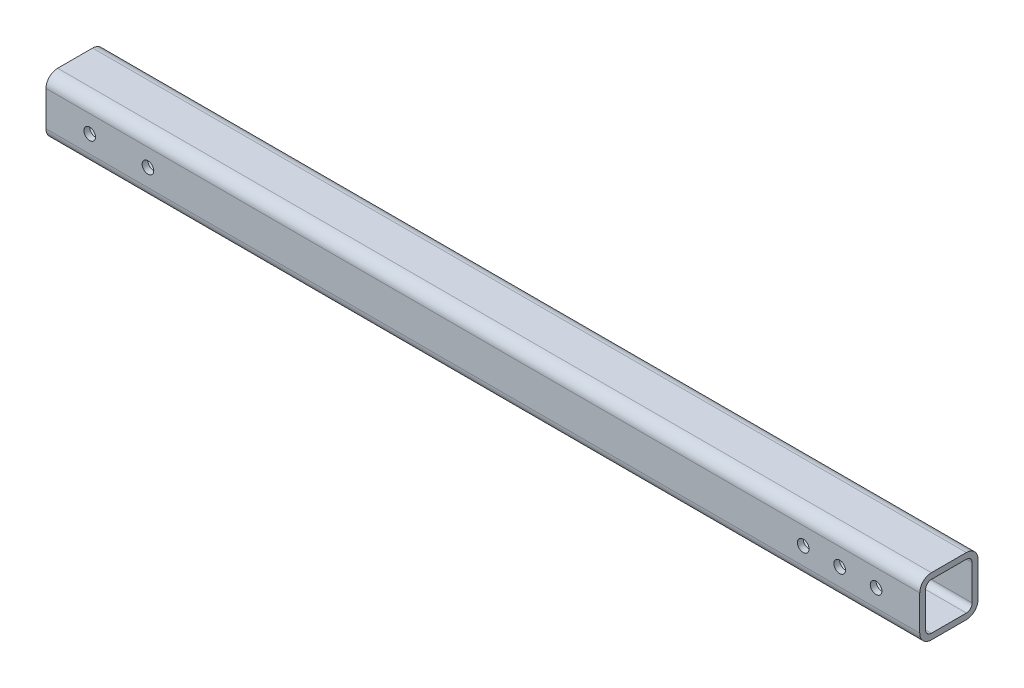
ISO-10303-21;
HEADER;
FILE_DESCRIPTION(('STEP AP214'),'2;1');
FILE_NAME('part.step','',(''),(''),'','','');
FILE_SCHEMA(('AUTOMOTIVE_DESIGN { 1 0 10303 214 1 1 1 1 }'));
ENDSEC;
DATA;
#1=APPLICATION_CONTEXT('core data for automotive mechanical design processes');
#2=APPLICATION_PROTOCOL_DEFINITION('international standard','automotive_design',2000,#1);
#3=PRODUCT_CONTEXT('',#1,'mechanical');
#4=PRODUCT('Part','Part','',(#3));
#5=PRODUCT_RELATED_PRODUCT_CATEGORY('part','',(#4));
#6=PRODUCT_DEFINITION_FORMATION('','',#4);
#7=PRODUCT_DEFINITION_CONTEXT('part definition',#1,'design');
#8=PRODUCT_DEFINITION('design','',#6,#7);
#9=PRODUCT_DEFINITION_SHAPE('','',#8);
#10=(LENGTH_UNIT() NAMED_UNIT(*) SI_UNIT(.MILLI.,.METRE.));
#11=(NAMED_UNIT(*) PLANE_ANGLE_UNIT() SI_UNIT($,.RADIAN.));
#12=(NAMED_UNIT(*) SI_UNIT($,.STERADIAN.) SOLID_ANGLE_UNIT());
#13=UNCERTAINTY_MEASURE_WITH_UNIT(LENGTH_MEASURE(1.E-05),#10,'distance_accuracy_value','');
#14=(GEOMETRIC_REPRESENTATION_CONTEXT(3) GLOBAL_UNCERTAINTY_ASSIGNED_CONTEXT((#13)) GLOBAL_UNIT_ASSIGNED_CONTEXT((#10,
#11,#12)) REPRESENTATION_CONTEXT('',''));
#15=CARTESIAN_POINT('',(0.,0.,0.));
#16=DIRECTION('',(0.,0.,1.));
#17=DIRECTION('',(1.,0.,0.));
#18=AXIS2_PLACEMENT_3D('',#15,#16,#17);
#19=CARTESIAN_POINT('',(300.,12.,-12.));
#20=DIRECTION('',(-1.,0.,0.));
#21=DIRECTION('',(0.,0.,1.));
#22=AXIS2_PLACEMENT_3D('',#19,#20,#21);
#23=CYLINDRICAL_SURFACE('',#22,8.);
#24=CARTESIAN_POINT('',(-300.,12.,-12.));
#25=DIRECTION('',(1.,0.,0.));
#26=DIRECTION('',(0.,0.,-1.));
#27=AXIS2_PLACEMENT_3D('',#24,#25,#26);
#28=CIRCLE('',#27,8.);
#29=CARTESIAN_POINT('',(-300.,12.,-20.));
#30=VERTEX_POINT('',#29);
#31=CARTESIAN_POINT('',(-300.,20.,-12.));
#32=VERTEX_POINT('',#31);
#33=EDGE_CURVE('E254',#30,#32,#28,.T.);
#34=ORIENTED_EDGE('',*,*,#33,.T.);
#35=DIRECTION('',(-1.,0.,0.));
#36=VECTOR('',#35,1.);
#37=CARTESIAN_POINT('',(300.,20.,-12.));
#38=LINE('',#37,#36);
#39=CARTESIAN_POINT('',(300.,20.,-12.));
#40=VERTEX_POINT('',#39);
#41=EDGE_CURVE('E12',#40,#32,#38,.T.);
#42=ORIENTED_EDGE('',*,*,#41,.F.);
#43=CARTESIAN_POINT('',(300.,12.,-12.));
#44=DIRECTION('',(1.,0.,0.));
#45=DIRECTION('',(0.,0.,-1.));
#46=AXIS2_PLACEMENT_3D('',#43,#44,#45);
#47=CIRCLE('',#46,8.);
#48=CARTESIAN_POINT('',(300.,12.,-20.));
#49=VERTEX_POINT('',#48);
#50=EDGE_CURVE('E403',#49,#40,#47,.T.);
#51=ORIENTED_EDGE('',*,*,#50,.F.);
#52=DIRECTION('',(-1.,0.,0.));
#53=VECTOR('',#52,1.);
#54=CARTESIAN_POINT('',(300.,12.,-20.));
#55=LINE('',#54,#53);
#56=EDGE_CURVE('E277',#49,#30,#55,.T.);
#57=ORIENTED_EDGE('',*,*,#56,.T.);
#58=EDGE_LOOP('',(#34,#42,#51,#57));
#59=FACE_BOUND('',#58,.T.);
#60=ADVANCED_FACE('F67',(#59),#23,.T.);
#61=CARTESIAN_POINT('',(300.,20.,-12.));
#62=DIRECTION('',(0.,-1.,0.));
#63=DIRECTION('',(0.,0.,-1.));
#64=AXIS2_PLACEMENT_3D('',#61,#62,#63);
#65=PLANE('',#64);
#66=DIRECTION('',(0.,0.,1.));
#67=VECTOR('',#66,1.);
#68=CARTESIAN_POINT('',(-300.,20.,-12.));
#69=LINE('',#68,#67);
#70=CARTESIAN_POINT('',(-300.,20.,12.));
#71=VERTEX_POINT('',#70);
#72=EDGE_CURVE('E258',#32,#71,#69,.T.);
#73=ORIENTED_EDGE('',*,*,#72,.T.);
#74=DIRECTION('',(-1.,0.,0.));
#75=VECTOR('',#74,1.);
#76=CARTESIAN_POINT('',(300.,20.,12.));
#77=LINE('',#76,#75);
#78=CARTESIAN_POINT('',(300.,20.,12.));
#79=VERTEX_POINT('',#78);
#80=EDGE_CURVE('E78',#79,#71,#77,.T.);
#81=ORIENTED_EDGE('',*,*,#80,.F.);
#82=DIRECTION('',(0.,0.,1.));
#83=VECTOR('',#82,1.);
#84=CARTESIAN_POINT('',(300.,20.,-12.));
#85=LINE('',#84,#83);
#86=EDGE_CURVE('E406',#40,#79,#85,.T.);
#87=ORIENTED_EDGE('',*,*,#86,.F.);
#88=ORIENTED_EDGE('',*,*,#41,.T.);
#89=EDGE_LOOP('',(#73,#81,#87,#88));
#90=FACE_BOUND('',#89,.T.);
#91=ADVANCED_FACE('F443',(#90),#65,.F.);
#92=CARTESIAN_POINT('',(300.,12.,12.));
#93=DIRECTION('',(-1.,0.,0.));
#94=DIRECTION('',(0.,0.,1.));
#95=AXIS2_PLACEMENT_3D('',#92,#93,#94);
#96=CYLINDRICAL_SURFACE('',#95,8.);
#97=CARTESIAN_POINT('',(-300.,12.,12.));
#98=DIRECTION('',(1.,0.,0.));
#99=DIRECTION('',(0.,0.,-1.));
#100=AXIS2_PLACEMENT_3D('',#97,#98,#99);
#101=CIRCLE('',#100,8.);
#102=CARTESIAN_POINT('',(-300.,12.,20.));
#103=VERTEX_POINT('',#102);
#104=EDGE_CURVE('E261',#71,#103,#101,.T.);
#105=ORIENTED_EDGE('',*,*,#104,.T.);
#106=DIRECTION('',(-1.,0.,0.));
#107=VECTOR('',#106,1.);
#108=CARTESIAN_POINT('',(300.,12.,20.));
#109=LINE('',#108,#107);
#110=CARTESIAN_POINT('',(300.,12.,20.));
#111=VERTEX_POINT('',#110);
#112=EDGE_CURVE('E288',#111,#103,#109,.T.);
#113=ORIENTED_EDGE('',*,*,#112,.F.);
#114=CARTESIAN_POINT('',(300.,12.,12.));
#115=DIRECTION('',(1.,0.,0.));
#116=DIRECTION('',(0.,0.,-1.));
#117=AXIS2_PLACEMENT_3D('',#114,#115,#116);
#118=CIRCLE('',#117,8.);
#119=EDGE_CURVE('E409',#79,#111,#118,.T.);
#120=ORIENTED_EDGE('',*,*,#119,.F.);
#121=ORIENTED_EDGE('',*,*,#80,.T.);
#122=EDGE_LOOP('',(#105,#113,#120,#121));
#123=FACE_BOUND('',#122,.T.);
#124=ADVANCED_FACE('F449',(#123),#96,.T.);
#125=CARTESIAN_POINT('',(300.,-12.,20.));
#126=DIRECTION('',(0.,0.,-1.));
#127=DIRECTION('',(-1.,0.,0.));
#128=AXIS2_PLACEMENT_3D('',#125,#126,#127);
#129=PLANE('',#128);
#130=CARTESIAN_POINT('',(-270.,0.,20.));
#131=DIRECTION('',(0.,0.,-1.));
#132=DIRECTION('',(-1.,0.,0.));
#133=AXIS2_PLACEMENT_3D('',#130,#131,#132);
#134=CIRCLE('',#133,3.99999999999999);
#135=CARTESIAN_POINT('',(-274.,0.,20.));
#136=VERTEX_POINT('',#135);
#137=EDGE_CURVE('E226',#136,#136,#134,.T.);
#138=ORIENTED_EDGE('',*,*,#137,.T.);
#139=EDGE_LOOP('',(#138));
#140=FACE_BOUND('',#139,.T.);
#141=CARTESIAN_POINT('',(-230.,0.,20.));
#142=DIRECTION('',(0.,0.,-1.));
#143=DIRECTION('',(-1.,0.,0.));
#144=AXIS2_PLACEMENT_3D('',#141,#142,#143);
#145=CIRCLE('',#144,3.99999999999999);
#146=CARTESIAN_POINT('',(-234.,0.,20.));
#147=VERTEX_POINT('',#146);
#148=EDGE_CURVE('E358',#147,#147,#145,.T.);
#149=ORIENTED_EDGE('',*,*,#148,.T.);
#150=EDGE_LOOP('',(#149));
#151=FACE_BOUND('',#150,.T.);
#152=CARTESIAN_POINT('',(220.,0.,20.));
#153=DIRECTION('',(0.,0.,-1.));
#154=DIRECTION('',(-1.,0.,0.));
#155=AXIS2_PLACEMENT_3D('',#152,#153,#154);
#156=CIRCLE('',#155,3.99999999999999);
#157=CARTESIAN_POINT('',(216.,0.,20.));
#158=VERTEX_POINT('',#157);
#159=EDGE_CURVE('E337',#158,#158,#156,.T.);
#160=ORIENTED_EDGE('',*,*,#159,.T.);
#161=EDGE_LOOP('',(#160));
#162=FACE_BOUND('',#161,.T.);
#163=CARTESIAN_POINT('',(245.,0.,20.));
#164=DIRECTION('',(0.,0.,-1.));
#165=DIRECTION('',(-1.,0.,0.));
#166=AXIS2_PLACEMENT_3D('',#163,#164,#165);
#167=CIRCLE('',#166,3.99999999999999);
#168=CARTESIAN_POINT('',(241.,0.,20.));
#169=VERTEX_POINT('',#168);
#170=EDGE_CURVE('E332',#169,#169,#167,.T.);
#171=ORIENTED_EDGE('',*,*,#170,.T.);
#172=EDGE_LOOP('',(#171));
#173=FACE_BOUND('',#172,.T.);
#174=CARTESIAN_POINT('',(270.,0.,20.));
#175=DIRECTION('',(0.,0.,-1.));
#176=DIRECTION('',(-1.,0.,0.));
#177=AXIS2_PLACEMENT_3D('',#174,#175,#176);
#178=CIRCLE('',#177,3.99999999999999);
#179=CARTESIAN_POINT('',(266.,0.,20.));
#180=VERTEX_POINT('',#179);
#181=EDGE_CURVE('E327',#180,#180,#178,.T.);
#182=ORIENTED_EDGE('',*,*,#181,.T.);
#183=EDGE_LOOP('',(#182));
#184=FACE_BOUND('',#183,.T.);
#185=DIRECTION('',(0.,-1.,0.));
#186=VECTOR('',#185,1.);
#187=CARTESIAN_POINT('',(-300.,-12.,20.));
#188=LINE('',#187,#186);
#189=CARTESIAN_POINT('',(-300.,-12.,20.));
#190=VERTEX_POINT('',#189);
#191=EDGE_CURVE('E264',#103,#190,#188,.T.);
#192=ORIENTED_EDGE('',*,*,#191,.T.);
#193=DIRECTION('',(-1.,0.,0.));
#194=VECTOR('',#193,1.);
#195=CARTESIAN_POINT('',(300.,-12.,20.));
#196=LINE('',#195,#194);
#197=CARTESIAN_POINT('',(300.,-12.,20.));
#198=VERTEX_POINT('',#197);
#199=EDGE_CURVE('E284',#198,#190,#196,.T.);
#200=ORIENTED_EDGE('',*,*,#199,.F.);
#201=DIRECTION('',(0.,-1.,0.));
#202=VECTOR('',#201,1.);
#203=CARTESIAN_POINT('',(300.,-12.,20.));
#204=LINE('',#203,#202);
#205=EDGE_CURVE('E412',#111,#198,#204,.T.);
#206=ORIENTED_EDGE('',*,*,#205,.F.);
#207=ORIENTED_EDGE('',*,*,#112,.T.);
#208=EDGE_LOOP('',(#192,#200,#206,#207));
#209=FACE_BOUND('',#208,.T.);
#210=ADVANCED_FACE('F520',(#140,#151,#162,#173,#184,#209),#129,.F.);
#211=CARTESIAN_POINT('',(300.,-12.,12.));
#212=DIRECTION('',(-1.,0.,0.));
#213=DIRECTION('',(0.,0.,1.));
#214=AXIS2_PLACEMENT_3D('',#211,#212,#213);
#215=CYLINDRICAL_SURFACE('',#214,8.);
#216=CARTESIAN_POINT('',(-300.,-12.,12.));
#217=DIRECTION('',(1.,0.,0.));
#218=DIRECTION('',(0.,0.,-1.));
#219=AXIS2_PLACEMENT_3D('',#216,#217,#218);
#220=CIRCLE('',#219,8.);
#221=CARTESIAN_POINT('',(-300.,-20.,12.));
#222=VERTEX_POINT('',#221);
#223=EDGE_CURVE('E267',#190,#222,#220,.T.);
#224=ORIENTED_EDGE('',*,*,#223,.T.);
#225=DIRECTION('',(-1.,0.,0.));
#226=VECTOR('',#225,1.);
#227=CARTESIAN_POINT('',(300.,-20.,12.));
#228=LINE('',#227,#226);
#229=CARTESIAN_POINT('',(300.,-20.,12.));
#230=VERTEX_POINT('',#229);
#231=EDGE_CURVE('E210',#230,#222,#228,.T.);
#232=ORIENTED_EDGE('',*,*,#231,.F.);
#233=CARTESIAN_POINT('',(300.,-12.,12.));
#234=DIRECTION('',(1.,0.,0.));
#235=DIRECTION('',(0.,0.,-1.));
#236=AXIS2_PLACEMENT_3D('',#233,#234,#235);
#237=CIRCLE('',#236,8.);
#238=EDGE_CURVE('E199',#198,#230,#237,.T.);
#239=ORIENTED_EDGE('',*,*,#238,.F.);
#240=ORIENTED_EDGE('',*,*,#199,.T.);
#241=EDGE_LOOP('',(#224,#232,#239,#240));
#242=FACE_BOUND('',#241,.T.);
#243=ADVANCED_FACE('F517',(#242),#215,.T.);
#244=CARTESIAN_POINT('',(300.,-20.,12.));
#245=DIRECTION('',(0.,1.,0.));
#246=DIRECTION('',(0.,0.,1.));
#247=AXIS2_PLACEMENT_3D('',#244,#245,#246);
#248=PLANE('',#247);
#249=DIRECTION('',(0.,0.,-1.));
#250=VECTOR('',#249,1.);
#251=CARTESIAN_POINT('',(-300.,-20.,12.));
#252=LINE('',#251,#250);
#253=CARTESIAN_POINT('',(-300.,-20.,-12.));
#254=VERTEX_POINT('',#253);
#255=EDGE_CURVE('E208',#222,#254,#252,.T.);
#256=ORIENTED_EDGE('',*,*,#255,.T.);
#257=DIRECTION('',(-1.,0.,0.));
#258=VECTOR('',#257,1.);
#259=CARTESIAN_POINT('',(300.,-20.,-12.));
#260=LINE('',#259,#258);
#261=CARTESIAN_POINT('',(300.,-20.,-12.));
#262=VERTEX_POINT('',#261);
#263=EDGE_CURVE('E205',#262,#254,#260,.T.);
#264=ORIENTED_EDGE('',*,*,#263,.F.);
#265=DIRECTION('',(0.,0.,-1.));
#266=VECTOR('',#265,1.);
#267=CARTESIAN_POINT('',(300.,-20.,12.));
#268=LINE('',#267,#266);
#269=EDGE_CURVE('E193',#230,#262,#268,.T.);
#270=ORIENTED_EDGE('',*,*,#269,.F.);
#271=ORIENTED_EDGE('',*,*,#231,.T.);
#272=EDGE_LOOP('',(#256,#264,#270,#271));
#273=FACE_BOUND('',#272,.T.);
#274=ADVANCED_FACE('F206',(#273),#248,.F.);
#275=CARTESIAN_POINT('',(300.,-12.,-12.));
#276=DIRECTION('',(-1.,0.,0.));
#277=DIRECTION('',(0.,0.,1.));
#278=AXIS2_PLACEMENT_3D('',#275,#276,#277);
#279=CYLINDRICAL_SURFACE('',#278,8.);
#280=CARTESIAN_POINT('',(-300.,-12.,-12.));
#281=DIRECTION('',(1.,0.,0.));
#282=DIRECTION('',(0.,0.,-1.));
#283=AXIS2_PLACEMENT_3D('',#280,#281,#282);
#284=CIRCLE('',#283,8.);
#285=CARTESIAN_POINT('',(-300.,-12.,-20.));
#286=VERTEX_POINT('',#285);
#287=EDGE_CURVE('E140',#254,#286,#284,.T.);
#288=ORIENTED_EDGE('',*,*,#287,.T.);
#289=DIRECTION('',(-1.,0.,0.));
#290=VECTOR('',#289,1.);
#291=CARTESIAN_POINT('',(300.,-12.,-20.));
#292=LINE('',#291,#290);
#293=CARTESIAN_POINT('',(300.,-12.,-20.));
#294=VERTEX_POINT('',#293);
#295=EDGE_CURVE('E211',#294,#286,#292,.T.);
#296=ORIENTED_EDGE('',*,*,#295,.F.);
#297=CARTESIAN_POINT('',(300.,-12.,-12.));
#298=DIRECTION('',(1.,0.,0.));
#299=DIRECTION('',(0.,0.,-1.));
#300=AXIS2_PLACEMENT_3D('',#297,#298,#299);
#301=CIRCLE('',#300,8.);
#302=EDGE_CURVE('E197',#262,#294,#301,.T.);
#303=ORIENTED_EDGE('',*,*,#302,.F.);
#304=ORIENTED_EDGE('',*,*,#263,.T.);
#305=EDGE_LOOP('',(#288,#296,#303,#304));
#306=FACE_BOUND('',#305,.T.);
#307=ADVANCED_FACE('F213',(#306),#279,.T.);
#308=CARTESIAN_POINT('',(300.,12.,12.));
#309=DIRECTION('',(-1.,0.,0.));
#310=DIRECTION('',(0.,0.,1.));
#311=AXIS2_PLACEMENT_3D('',#308,#309,#310);
#312=CYLINDRICAL_SURFACE('',#311,4.00000000000001);
#313=CARTESIAN_POINT('',(-300.,12.,12.));
#314=DIRECTION('',(1.,0.,0.));
#315=DIRECTION('',(0.,0.,-1.));
#316=AXIS2_PLACEMENT_3D('',#313,#314,#315);
#317=CIRCLE('',#316,4.00000000000001);
#318=CARTESIAN_POINT('',(-300.,16.,12.));
#319=VERTEX_POINT('',#318);
#320=CARTESIAN_POINT('',(-300.,12.,16.));
#321=VERTEX_POINT('',#320);
#322=EDGE_CURVE('E221',#319,#321,#317,.T.);
#323=ORIENTED_EDGE('',*,*,#322,.F.);
#324=DIRECTION('',(-1.,0.,0.));
#325=VECTOR('',#324,1.);
#326=CARTESIAN_POINT('',(300.,16.,12.));
#327=LINE('',#326,#325);
#328=CARTESIAN_POINT('',(300.,16.,12.));
#329=VERTEX_POINT('',#328);
#330=EDGE_CURVE('E154',#329,#319,#327,.T.);
#331=ORIENTED_EDGE('',*,*,#330,.F.);
#332=CARTESIAN_POINT('',(300.,12.,12.));
#333=DIRECTION('',(1.,0.,0.));
#334=DIRECTION('',(0.,0.,-1.));
#335=AXIS2_PLACEMENT_3D('',#332,#333,#334);
#336=CIRCLE('',#335,4.00000000000001);
#337=CARTESIAN_POINT('',(300.,12.,16.));
#338=VERTEX_POINT('',#337);
#339=EDGE_CURVE('E276',#329,#338,#336,.T.);
#340=ORIENTED_EDGE('',*,*,#339,.T.);
#341=DIRECTION('',(-1.,0.,0.));
#342=VECTOR('',#341,1.);
#343=CARTESIAN_POINT('',(300.,12.,16.));
#344=LINE('',#343,#342);
#345=EDGE_CURVE('E217',#338,#321,#344,.T.);
#346=ORIENTED_EDGE('',*,*,#345,.T.);
#347=EDGE_LOOP('',(#323,#331,#340,#346));
#348=FACE_BOUND('',#347,.T.);
#349=ADVANCED_FACE('F69',(#348),#312,.F.);
#350=CARTESIAN_POINT('',(300.,16.,-12.));
#351=DIRECTION('',(0.,-1.,0.));
#352=DIRECTION('',(0.,0.,-1.));
#353=AXIS2_PLACEMENT_3D('',#350,#351,#352);
#354=PLANE('',#353);
#355=DIRECTION('',(0.,0.,1.));
#356=VECTOR('',#355,1.);
#357=CARTESIAN_POINT('',(-300.,16.,-12.));
#358=LINE('',#357,#356);
#359=CARTESIAN_POINT('',(-300.,16.,-12.));
#360=VERTEX_POINT('',#359);
#361=EDGE_CURVE('E225',#360,#319,#358,.T.);
#362=ORIENTED_EDGE('',*,*,#361,.F.);
#363=DIRECTION('',(-1.,0.,0.));
#364=VECTOR('',#363,1.);
#365=CARTESIAN_POINT('',(300.,16.,-12.));
#366=LINE('',#365,#364);
#367=CARTESIAN_POINT('',(300.,16.,-12.));
#368=VERTEX_POINT('',#367);
#369=EDGE_CURVE('E312',#368,#360,#366,.T.);
#370=ORIENTED_EDGE('',*,*,#369,.F.);
#371=DIRECTION('',(0.,0.,1.));
#372=VECTOR('',#371,1.);
#373=CARTESIAN_POINT('',(300.,16.,-12.));
#374=LINE('',#373,#372);
#375=EDGE_CURVE('E375',#368,#329,#374,.T.);
#376=ORIENTED_EDGE('',*,*,#375,.T.);
#377=ORIENTED_EDGE('',*,*,#330,.T.);
#378=EDGE_LOOP('',(#362,#370,#376,#377));
#379=FACE_BOUND('',#378,.T.);
#380=ADVANCED_FACE('F476',(#379),#354,.T.);
#381=CARTESIAN_POINT('',(300.,12.,-12.));
#382=DIRECTION('',(-1.,0.,0.));
#383=DIRECTION('',(0.,0.,1.));
#384=AXIS2_PLACEMENT_3D('',#381,#382,#383);
#385=CYLINDRICAL_SURFACE('',#384,4.00000000000001);
#386=CARTESIAN_POINT('',(-300.,12.,-12.));
#387=DIRECTION('',(1.,0.,0.));
#388=DIRECTION('',(0.,0.,-1.));
#389=AXIS2_PLACEMENT_3D('',#386,#387,#388);
#390=CIRCLE('',#389,4.00000000000001);
#391=CARTESIAN_POINT('',(-300.,12.,-16.));
#392=VERTEX_POINT('',#391);
#393=EDGE_CURVE('E230',#392,#360,#390,.T.);
#394=ORIENTED_EDGE('',*,*,#393,.F.);
#395=DIRECTION('',(-1.,0.,0.));
#396=VECTOR('',#395,1.);
#397=CARTESIAN_POINT('',(300.,12.,-16.));
#398=LINE('',#397,#396);
#399=CARTESIAN_POINT('',(300.,12.,-16.));
#400=VERTEX_POINT('',#399);
#401=EDGE_CURVE('E309',#400,#392,#398,.T.);
#402=ORIENTED_EDGE('',*,*,#401,.F.);
#403=CARTESIAN_POINT('',(300.,12.,-12.));
#404=DIRECTION('',(1.,0.,0.));
#405=DIRECTION('',(0.,0.,-1.));
#406=AXIS2_PLACEMENT_3D('',#403,#404,#405);
#407=CIRCLE('',#406,4.00000000000001);
#408=EDGE_CURVE('E379',#400,#368,#407,.T.);
#409=ORIENTED_EDGE('',*,*,#408,.T.);
#410=ORIENTED_EDGE('',*,*,#369,.T.);
#411=EDGE_LOOP('',(#394,#402,#409,#410));
#412=FACE_BOUND('',#411,.T.);
#413=ADVANCED_FACE('F473',(#412),#385,.F.);
#414=CARTESIAN_POINT('',(300.,12.,-16.));
#415=DIRECTION('',(0.,0.,1.));
#416=DIRECTION('',(1.,0.,0.));
#417=AXIS2_PLACEMENT_3D('',#414,#415,#416);
#418=PLANE('',#417);
#419=CARTESIAN_POINT('',(-270.,0.,-16.));
#420=DIRECTION('',(0.,0.,1.));
#421=DIRECTION('',(1.,0.,0.));
#422=AXIS2_PLACEMENT_3D('',#419,#420,#421);
#423=CIRCLE('',#422,3.99999999999999);
#424=CARTESIAN_POINT('',(-266.,0.,-16.));
#425=VERTEX_POINT('',#424);
#426=EDGE_CURVE('E366',#425,#425,#423,.T.);
#427=ORIENTED_EDGE('',*,*,#426,.F.);
#428=EDGE_LOOP('',(#427));
#429=FACE_BOUND('',#428,.T.);
#430=CARTESIAN_POINT('',(-230.,0.,-16.));
#431=DIRECTION('',(0.,0.,1.));
#432=DIRECTION('',(1.,0.,0.));
#433=AXIS2_PLACEMENT_3D('',#430,#431,#432);
#434=CIRCLE('',#433,3.99999999999999);
#435=CARTESIAN_POINT('',(-226.,0.,-16.));
#436=VERTEX_POINT('',#435);
#437=EDGE_CURVE('E343',#436,#436,#434,.T.);
#438=ORIENTED_EDGE('',*,*,#437,.F.);
#439=EDGE_LOOP('',(#438));
#440=FACE_BOUND('',#439,.T.);
#441=CARTESIAN_POINT('',(220.,0.,-16.));
#442=DIRECTION('',(0.,0.,1.));
#443=DIRECTION('',(1.,0.,0.));
#444=AXIS2_PLACEMENT_3D('',#441,#442,#443);
#445=CIRCLE('',#444,3.99999999999999);
#446=CARTESIAN_POINT('',(224.,0.,-16.));
#447=VERTEX_POINT('',#446);
#448=EDGE_CURVE('E346',#447,#447,#445,.T.);
#449=ORIENTED_EDGE('',*,*,#448,.F.);
#450=EDGE_LOOP('',(#449));
#451=FACE_BOUND('',#450,.T.);
#452=CARTESIAN_POINT('',(245.,0.,-16.));
#453=DIRECTION('',(0.,0.,1.));
#454=DIRECTION('',(1.,0.,0.));
#455=AXIS2_PLACEMENT_3D('',#452,#453,#454);
#456=CIRCLE('',#455,3.99999999999999);
#457=CARTESIAN_POINT('',(249.,0.,-16.));
#458=VERTEX_POINT('',#457);
#459=EDGE_CURVE('E706',#458,#458,#456,.T.);
#460=ORIENTED_EDGE('',*,*,#459,.F.);
#461=EDGE_LOOP('',(#460));
#462=FACE_BOUND('',#461,.T.);
#463=CARTESIAN_POINT('',(270.,0.,-16.));
#464=DIRECTION('',(0.,0.,1.));
#465=DIRECTION('',(1.,0.,0.));
#466=AXIS2_PLACEMENT_3D('',#463,#464,#465);
#467=CIRCLE('',#466,3.99999999999999);
#468=CARTESIAN_POINT('',(274.,0.,-16.));
#469=VERTEX_POINT('',#468);
#470=EDGE_CURVE('E696',#469,#469,#467,.T.);
#471=ORIENTED_EDGE('',*,*,#470,.F.);
#472=EDGE_LOOP('',(#471));
#473=FACE_BOUND('',#472,.T.);
#474=DIRECTION('',(0.,1.,0.));
#475=VECTOR('',#474,1.);
#476=CARTESIAN_POINT('',(-300.,12.,-16.));
#477=LINE('',#476,#475);
#478=CARTESIAN_POINT('',(-300.,-12.,-16.));
#479=VERTEX_POINT('',#478);
#480=EDGE_CURVE('E234',#479,#392,#477,.T.);
#481=ORIENTED_EDGE('',*,*,#480,.F.);
#482=DIRECTION('',(-1.,0.,0.));
#483=VECTOR('',#482,1.);
#484=CARTESIAN_POINT('',(300.,-12.,-16.));
#485=LINE('',#484,#483);
#486=CARTESIAN_POINT('',(300.,-12.,-16.));
#487=VERTEX_POINT('',#486);
#488=EDGE_CURVE('E306',#487,#479,#485,.T.);
#489=ORIENTED_EDGE('',*,*,#488,.F.);
#490=DIRECTION('',(0.,1.,0.));
#491=VECTOR('',#490,1.);
#492=CARTESIAN_POINT('',(300.,12.,-16.));
#493=LINE('',#492,#491);
#494=EDGE_CURVE('E383',#487,#400,#493,.T.);
#495=ORIENTED_EDGE('',*,*,#494,.T.);
#496=ORIENTED_EDGE('',*,*,#401,.T.);
#497=EDGE_LOOP('',(#481,#489,#495,#496));
#498=FACE_BOUND('',#497,.T.);
#499=ADVANCED_FACE('F469',(#429,#440,#451,#462,#473,#498),#418,.T.);
#500=CARTESIAN_POINT('',(300.,-12.,-12.));
#501=DIRECTION('',(-1.,0.,0.));
#502=DIRECTION('',(0.,0.,1.));
#503=AXIS2_PLACEMENT_3D('',#500,#501,#502);
#504=CYLINDRICAL_SURFACE('',#503,4.00000000000001);
#505=CARTESIAN_POINT('',(-300.,-12.,-12.));
#506=DIRECTION('',(1.,0.,0.));
#507=DIRECTION('',(0.,0.,-1.));
#508=AXIS2_PLACEMENT_3D('',#505,#506,#507);
#509=CIRCLE('',#508,4.00000000000001);
#510=CARTESIAN_POINT('',(-300.,-16.,-12.));
#511=VERTEX_POINT('',#510);
#512=EDGE_CURVE('E238',#511,#479,#509,.T.);
#513=ORIENTED_EDGE('',*,*,#512,.F.);
#514=DIRECTION('',(-1.,0.,0.));
#515=VECTOR('',#514,1.);
#516=CARTESIAN_POINT('',(300.,-16.,-12.));
#517=LINE('',#516,#515);
#518=CARTESIAN_POINT('',(300.,-16.,-12.));
#519=VERTEX_POINT('',#518);
#520=EDGE_CURVE('E303',#519,#511,#517,.T.);
#521=ORIENTED_EDGE('',*,*,#520,.F.);
#522=CARTESIAN_POINT('',(300.,-12.,-12.));
#523=DIRECTION('',(1.,0.,0.));
#524=DIRECTION('',(0.,0.,-1.));
#525=AXIS2_PLACEMENT_3D('',#522,#523,#524);
#526=CIRCLE('',#525,4.00000000000001);
#527=EDGE_CURVE('E387',#519,#487,#526,.T.);
#528=ORIENTED_EDGE('',*,*,#527,.T.);
#529=ORIENTED_EDGE('',*,*,#488,.T.);
#530=EDGE_LOOP('',(#513,#521,#528,#529));
#531=FACE_BOUND('',#530,.T.);
#532=ADVANCED_FACE('F465',(#531),#504,.F.);
#533=CARTESIAN_POINT('',(300.,-16.,12.));
#534=DIRECTION('',(0.,1.,0.));
#535=DIRECTION('',(0.,0.,1.));
#536=AXIS2_PLACEMENT_3D('',#533,#534,#535);
#537=PLANE('',#536);
#538=DIRECTION('',(0.,0.,-1.));
#539=VECTOR('',#538,1.);
#540=CARTESIAN_POINT('',(-300.,-16.,12.));
#541=LINE('',#540,#539);
#542=CARTESIAN_POINT('',(-300.,-16.,12.));
#543=VERTEX_POINT('',#542);
#544=EDGE_CURVE('E242',#543,#511,#541,.T.);
#545=ORIENTED_EDGE('',*,*,#544,.F.);
#546=DIRECTION('',(-1.,0.,0.));
#547=VECTOR('',#546,1.);
#548=CARTESIAN_POINT('',(300.,-16.,12.));
#549=LINE('',#548,#547);
#550=CARTESIAN_POINT('',(300.,-16.,12.));
#551=VERTEX_POINT('',#550);
#552=EDGE_CURVE('E300',#551,#543,#549,.T.);
#553=ORIENTED_EDGE('',*,*,#552,.F.);
#554=DIRECTION('',(0.,0.,-1.));
#555=VECTOR('',#554,1.);
#556=CARTESIAN_POINT('',(300.,-16.,12.));
#557=LINE('',#556,#555);
#558=EDGE_CURVE('E391',#551,#519,#557,.T.);
#559=ORIENTED_EDGE('',*,*,#558,.T.);
#560=ORIENTED_EDGE('',*,*,#520,.T.);
#561=EDGE_LOOP('',(#545,#553,#559,#560));
#562=FACE_BOUND('',#561,.T.);
#563=ADVANCED_FACE('F461',(#562),#537,.T.);
#564=CARTESIAN_POINT('',(300.,-12.,12.));
#565=DIRECTION('',(-1.,0.,0.));
#566=DIRECTION('',(0.,0.,1.));
#567=AXIS2_PLACEMENT_3D('',#564,#565,#566);
#568=CYLINDRICAL_SURFACE('',#567,4.00000000000001);
#569=CARTESIAN_POINT('',(-300.,-12.,12.));
#570=DIRECTION('',(1.,0.,0.));
#571=DIRECTION('',(0.,0.,-1.));
#572=AXIS2_PLACEMENT_3D('',#569,#570,#571);
#573=CIRCLE('',#572,4.00000000000001);
#574=CARTESIAN_POINT('',(-300.,-12.,16.));
#575=VERTEX_POINT('',#574);
#576=EDGE_CURVE('E246',#575,#543,#573,.T.);
#577=ORIENTED_EDGE('',*,*,#576,.F.);
#578=DIRECTION('',(-1.,0.,0.));
#579=VECTOR('',#578,1.);
#580=CARTESIAN_POINT('',(300.,-12.,16.));
#581=LINE('',#580,#579);
#582=CARTESIAN_POINT('',(300.,-12.,16.));
#583=VERTEX_POINT('',#582);
#584=EDGE_CURVE('E297',#583,#575,#581,.T.);
#585=ORIENTED_EDGE('',*,*,#584,.F.);
#586=CARTESIAN_POINT('',(300.,-12.,12.));
#587=DIRECTION('',(1.,0.,0.));
#588=DIRECTION('',(0.,0.,-1.));
#589=AXIS2_PLACEMENT_3D('',#586,#587,#588);
#590=CIRCLE('',#589,4.00000000000001);
#591=EDGE_CURVE('E395',#583,#551,#590,.T.);
#592=ORIENTED_EDGE('',*,*,#591,.T.);
#593=ORIENTED_EDGE('',*,*,#552,.T.);
#594=EDGE_LOOP('',(#577,#585,#592,#593));
#595=FACE_BOUND('',#594,.T.);
#596=ADVANCED_FACE('F457',(#595),#568,.F.);
#597=CARTESIAN_POINT('',(300.,-12.,16.));
#598=DIRECTION('',(0.,0.,-1.));
#599=DIRECTION('',(-1.,0.,0.));
#600=AXIS2_PLACEMENT_3D('',#597,#598,#599);
#601=PLANE('',#600);
#602=CARTESIAN_POINT('',(-270.,0.,16.));
#603=DIRECTION('',(0.,0.,-1.));
#604=DIRECTION('',(-1.,0.,0.));
#605=AXIS2_PLACEMENT_3D('',#602,#603,#604);
#606=CIRCLE('',#605,3.99999999999999);
#607=CARTESIAN_POINT('',(-274.,0.,16.));
#608=VERTEX_POINT('',#607);
#609=EDGE_CURVE('E362',#608,#608,#606,.T.);
#610=ORIENTED_EDGE('',*,*,#609,.F.);
#611=EDGE_LOOP('',(#610));
#612=FACE_BOUND('',#611,.T.);
#613=CARTESIAN_POINT('',(-230.,0.,16.));
#614=DIRECTION('',(0.,0.,-1.));
#615=DIRECTION('',(-1.,0.,0.));
#616=AXIS2_PLACEMENT_3D('',#613,#614,#615);
#617=CIRCLE('',#616,3.99999999999999);
#618=CARTESIAN_POINT('',(-234.,0.,16.));
#619=VERTEX_POINT('',#618);
#620=EDGE_CURVE('E336',#619,#619,#617,.T.);
#621=ORIENTED_EDGE('',*,*,#620,.F.);
#622=EDGE_LOOP('',(#621));
#623=FACE_BOUND('',#622,.T.);
#624=CARTESIAN_POINT('',(220.,0.,16.));
#625=DIRECTION('',(0.,0.,-1.));
#626=DIRECTION('',(-1.,0.,0.));
#627=AXIS2_PLACEMENT_3D('',#624,#625,#626);
#628=CIRCLE('',#627,3.99999999999999);
#629=CARTESIAN_POINT('',(216.,0.,16.));
#630=VERTEX_POINT('',#629);
#631=EDGE_CURVE('E331',#630,#630,#628,.T.);
#632=ORIENTED_EDGE('',*,*,#631,.F.);
#633=EDGE_LOOP('',(#632));
#634=FACE_BOUND('',#633,.T.);
#635=CARTESIAN_POINT('',(245.,0.,16.));
#636=DIRECTION('',(0.,0.,-1.));
#637=DIRECTION('',(-1.,0.,0.));
#638=AXIS2_PLACEMENT_3D('',#635,#636,#637);
#639=CIRCLE('',#638,3.99999999999999);
#640=CARTESIAN_POINT('',(241.,0.,16.));
#641=VERTEX_POINT('',#640);
#642=EDGE_CURVE('E326',#641,#641,#639,.T.);
#643=ORIENTED_EDGE('',*,*,#642,.F.);
#644=EDGE_LOOP('',(#643));
#645=FACE_BOUND('',#644,.T.);
#646=CARTESIAN_POINT('',(270.,0.,16.));
#647=DIRECTION('',(0.,0.,-1.));
#648=DIRECTION('',(-1.,0.,0.));
#649=AXIS2_PLACEMENT_3D('',#646,#647,#648);
#650=CIRCLE('',#649,3.99999999999999);
#651=CARTESIAN_POINT('',(266.,0.,16.));
#652=VERTEX_POINT('',#651);
#653=EDGE_CURVE('E321',#652,#652,#650,.T.);
#654=ORIENTED_EDGE('',*,*,#653,.F.);
#655=EDGE_LOOP('',(#654));
#656=FACE_BOUND('',#655,.T.);
#657=DIRECTION('',(0.,-1.,0.));
#658=VECTOR('',#657,1.);
#659=CARTESIAN_POINT('',(-300.,-12.,16.));
#660=LINE('',#659,#658);
#661=EDGE_CURVE('E250',#321,#575,#660,.T.);
#662=ORIENTED_EDGE('',*,*,#661,.F.);
#663=ORIENTED_EDGE('',*,*,#345,.F.);
#664=DIRECTION('',(0.,-1.,0.));
#665=VECTOR('',#664,1.);
#666=CARTESIAN_POINT('',(300.,-12.,16.));
#667=LINE('',#666,#665);
#668=EDGE_CURVE('E399',#338,#583,#667,.T.);
#669=ORIENTED_EDGE('',*,*,#668,.T.);
#670=ORIENTED_EDGE('',*,*,#584,.T.);
#671=EDGE_LOOP('',(#662,#663,#669,#670));
#672=FACE_BOUND('',#671,.T.);
#673=ADVANCED_FACE('F454',(#612,#623,#634,#645,#656,#672),#601,.T.);
#674=CARTESIAN_POINT('',(300.,12.,-20.));
#675=DIRECTION('',(0.,0.,1.));
#676=DIRECTION('',(1.,0.,0.));
#677=AXIS2_PLACEMENT_3D('',#674,#675,#676);
#678=PLANE('',#677);
#679=CARTESIAN_POINT('',(-270.,0.,-20.));
#680=DIRECTION('',(0.,0.,1.));
#681=DIRECTION('',(1.,0.,0.));
#682=AXIS2_PLACEMENT_3D('',#679,#680,#681);
#683=CIRCLE('',#682,3.99999999999999);
#684=CARTESIAN_POINT('',(-266.,0.,-20.));
#685=VERTEX_POINT('',#684);
#686=EDGE_CURVE('E71',#685,#685,#683,.T.);
#687=ORIENTED_EDGE('',*,*,#686,.T.);
#688=EDGE_LOOP('',(#687));
#689=FACE_BOUND('',#688,.T.);
#690=CARTESIAN_POINT('',(-230.,0.,-20.));
#691=DIRECTION('',(0.,0.,1.));
#692=DIRECTION('',(1.,0.,0.));
#693=AXIS2_PLACEMENT_3D('',#690,#691,#692);
#694=CIRCLE('',#693,3.99999999999999);
#695=CARTESIAN_POINT('',(-226.,0.,-20.));
#696=VERTEX_POINT('',#695);
#697=EDGE_CURVE('E333',#696,#696,#694,.T.);
#698=ORIENTED_EDGE('',*,*,#697,.T.);
#699=EDGE_LOOP('',(#698));
#700=FACE_BOUND('',#699,.T.);
#701=CARTESIAN_POINT('',(220.,0.,-20.));
#702=DIRECTION('',(0.,0.,1.));
#703=DIRECTION('',(1.,0.,0.));
#704=AXIS2_PLACEMENT_3D('',#701,#702,#703);
#705=CIRCLE('',#704,3.99999999999999);
#706=CARTESIAN_POINT('',(224.,0.,-20.));
#707=VERTEX_POINT('',#706);
#708=EDGE_CURVE('E328',#707,#707,#705,.T.);
#709=ORIENTED_EDGE('',*,*,#708,.T.);
#710=EDGE_LOOP('',(#709));
#711=FACE_BOUND('',#710,.T.);
#712=CARTESIAN_POINT('',(245.,0.,-20.));
#713=DIRECTION('',(0.,0.,1.));
#714=DIRECTION('',(1.,0.,0.));
#715=AXIS2_PLACEMENT_3D('',#712,#713,#714);
#716=CIRCLE('',#715,3.99999999999999);
#717=CARTESIAN_POINT('',(249.,0.,-20.));
#718=VERTEX_POINT('',#717);
#719=EDGE_CURVE('E322',#718,#718,#716,.T.);
#720=ORIENTED_EDGE('',*,*,#719,.T.);
#721=EDGE_LOOP('',(#720));
#722=FACE_BOUND('',#721,.T.);
#723=CARTESIAN_POINT('',(270.,0.,-20.));
#724=DIRECTION('',(0.,0.,1.));
#725=DIRECTION('',(1.,0.,0.));
#726=AXIS2_PLACEMENT_3D('',#723,#724,#725);
#727=CIRCLE('',#726,3.99999999999999);
#728=CARTESIAN_POINT('',(274.,0.,-20.));
#729=VERTEX_POINT('',#728);
#730=EDGE_CURVE('E317',#729,#729,#727,.T.);
#731=ORIENTED_EDGE('',*,*,#730,.T.);
#732=EDGE_LOOP('',(#731));
#733=FACE_BOUND('',#732,.T.);
#734=DIRECTION('',(0.,1.,0.));
#735=VECTOR('',#734,1.);
#736=CARTESIAN_POINT('',(-300.,12.,-20.));
#737=LINE('',#736,#735);
#738=EDGE_CURVE('E146',#286,#30,#737,.T.);
#739=ORIENTED_EDGE('',*,*,#738,.T.);
#740=ORIENTED_EDGE('',*,*,#56,.F.);
#741=DIRECTION('',(0.,1.,0.));
#742=VECTOR('',#741,1.);
#743=CARTESIAN_POINT('',(300.,12.,-20.));
#744=LINE('',#743,#742);
#745=EDGE_CURVE('E87',#294,#49,#744,.T.);
#746=ORIENTED_EDGE('',*,*,#745,.F.);
#747=ORIENTED_EDGE('',*,*,#295,.T.);
#748=EDGE_LOOP('',(#739,#740,#746,#747));
#749=FACE_BOUND('',#748,.T.);
#750=ADVANCED_FACE('F419',(#689,#700,#711,#722,#733,#749),#678,.F.);
#751=CARTESIAN_POINT('',(300.,12.,-12.));
#752=DIRECTION('',(1.,0.,0.));
#753=DIRECTION('',(0.,0.,-1.));
#754=AXIS2_PLACEMENT_3D('',#751,#752,#753);
#755=PLANE('',#754);
#756=ORIENTED_EDGE('',*,*,#339,.F.);
#757=ORIENTED_EDGE('',*,*,#375,.F.);
#758=ORIENTED_EDGE('',*,*,#408,.F.);
#759=ORIENTED_EDGE('',*,*,#494,.F.);
#760=ORIENTED_EDGE('',*,*,#527,.F.);
#761=ORIENTED_EDGE('',*,*,#558,.F.);
#762=ORIENTED_EDGE('',*,*,#591,.F.);
#763=ORIENTED_EDGE('',*,*,#668,.F.);
#764=EDGE_LOOP('',(#756,#757,#758,#759,#760,#761,#762,#763));
#765=FACE_BOUND('',#764,.T.);
#766=ORIENTED_EDGE('',*,*,#50,.T.);
#767=ORIENTED_EDGE('',*,*,#86,.T.);
#768=ORIENTED_EDGE('',*,*,#119,.T.);
#769=ORIENTED_EDGE('',*,*,#205,.T.);
#770=ORIENTED_EDGE('',*,*,#238,.T.);
#771=ORIENTED_EDGE('',*,*,#269,.T.);
#772=ORIENTED_EDGE('',*,*,#302,.T.);
#773=ORIENTED_EDGE('',*,*,#745,.T.);
#774=EDGE_LOOP('',(#766,#767,#768,#769,#770,#771,#772,#773));
#775=FACE_BOUND('',#774,.T.);
#776=ADVANCED_FACE('F195',(#765,#775),#755,.T.);
#777=CARTESIAN_POINT('',(-300.,12.,-12.));
#778=DIRECTION('',(1.,0.,0.));
#779=DIRECTION('',(0.,0.,-1.));
#780=AXIS2_PLACEMENT_3D('',#777,#778,#779);
#781=PLANE('',#780);
#782=ORIENTED_EDGE('',*,*,#322,.T.);
#783=ORIENTED_EDGE('',*,*,#661,.T.);
#784=ORIENTED_EDGE('',*,*,#576,.T.);
#785=ORIENTED_EDGE('',*,*,#544,.T.);
#786=ORIENTED_EDGE('',*,*,#512,.T.);
#787=ORIENTED_EDGE('',*,*,#480,.T.);
#788=ORIENTED_EDGE('',*,*,#393,.T.);
#789=ORIENTED_EDGE('',*,*,#361,.T.);
#790=EDGE_LOOP('',(#782,#783,#784,#785,#786,#787,#788,#789));
#791=FACE_BOUND('',#790,.T.);
#792=ORIENTED_EDGE('',*,*,#33,.F.);
#793=ORIENTED_EDGE('',*,*,#738,.F.);
#794=ORIENTED_EDGE('',*,*,#287,.F.);
#795=ORIENTED_EDGE('',*,*,#255,.F.);
#796=ORIENTED_EDGE('',*,*,#223,.F.);
#797=ORIENTED_EDGE('',*,*,#191,.F.);
#798=ORIENTED_EDGE('',*,*,#104,.F.);
#799=ORIENTED_EDGE('',*,*,#72,.F.);
#800=EDGE_LOOP('',(#792,#793,#794,#795,#796,#797,#798,#799));
#801=FACE_BOUND('',#800,.T.);
#802=ADVANCED_FACE('F487',(#791,#801),#781,.F.);
#803=CARTESIAN_POINT('',(270.,0.,-25.));
#804=DIRECTION('',(0.,0.,1.));
#805=DIRECTION('',(1.,0.,0.));
#806=AXIS2_PLACEMENT_3D('',#803,#804,#805);
#807=CYLINDRICAL_SURFACE('',#806,3.99999999999999);
#808=ORIENTED_EDGE('',*,*,#470,.T.);
#809=EDGE_LOOP('',(#808));
#810=FACE_BOUND('',#809,.T.);
#811=ORIENTED_EDGE('',*,*,#730,.F.);
#812=EDGE_LOOP('',(#811));
#813=FACE_BOUND('',#812,.T.);
#814=ADVANCED_FACE('F435',(#810,#813),#807,.F.);
#815=CARTESIAN_POINT('',(245.,0.,-25.));
#816=DIRECTION('',(0.,0.,1.));
#817=DIRECTION('',(1.,0.,0.));
#818=AXIS2_PLACEMENT_3D('',#815,#816,#817);
#819=CYLINDRICAL_SURFACE('',#818,3.99999999999999);
#820=ORIENTED_EDGE('',*,*,#459,.T.);
#821=EDGE_LOOP('',(#820));
#822=FACE_BOUND('',#821,.T.);
#823=ORIENTED_EDGE('',*,*,#719,.F.);
#824=EDGE_LOOP('',(#823));
#825=FACE_BOUND('',#824,.T.);
#826=ADVANCED_FACE('F621',(#822,#825),#819,.F.);
#827=CARTESIAN_POINT('',(220.,0.,-25.));
#828=DIRECTION('',(0.,0.,1.));
#829=DIRECTION('',(1.,0.,0.));
#830=AXIS2_PLACEMENT_3D('',#827,#828,#829);
#831=CYLINDRICAL_SURFACE('',#830,3.99999999999999);
#832=ORIENTED_EDGE('',*,*,#448,.T.);
#833=EDGE_LOOP('',(#832));
#834=FACE_BOUND('',#833,.T.);
#835=ORIENTED_EDGE('',*,*,#708,.F.);
#836=EDGE_LOOP('',(#835));
#837=FACE_BOUND('',#836,.T.);
#838=ADVANCED_FACE('F436',(#834,#837),#831,.F.);
#839=CARTESIAN_POINT('',(-230.,0.,-25.));
#840=DIRECTION('',(0.,0.,1.));
#841=DIRECTION('',(1.,0.,0.));
#842=AXIS2_PLACEMENT_3D('',#839,#840,#841);
#843=CYLINDRICAL_SURFACE('',#842,3.99999999999999);
#844=ORIENTED_EDGE('',*,*,#437,.T.);
#845=EDGE_LOOP('',(#844));
#846=FACE_BOUND('',#845,.T.);
#847=ORIENTED_EDGE('',*,*,#697,.F.);
#848=EDGE_LOOP('',(#847));
#849=FACE_BOUND('',#848,.T.);
#850=ADVANCED_FACE('F424',(#846,#849),#843,.F.);
#851=CARTESIAN_POINT('',(-270.,0.,-25.));
#852=DIRECTION('',(0.,0.,1.));
#853=DIRECTION('',(1.,0.,0.));
#854=AXIS2_PLACEMENT_3D('',#851,#852,#853);
#855=CYLINDRICAL_SURFACE('',#854,3.99999999999999);
#856=ORIENTED_EDGE('',*,*,#426,.T.);
#857=EDGE_LOOP('',(#856));
#858=FACE_BOUND('',#857,.T.);
#859=ORIENTED_EDGE('',*,*,#686,.F.);
#860=EDGE_LOOP('',(#859));
#861=FACE_BOUND('',#860,.T.);
#862=ADVANCED_FACE('F421',(#858,#861),#855,.F.);
#863=ORIENTED_EDGE('',*,*,#653,.T.);
#864=EDGE_LOOP('',(#863));
#865=FACE_BOUND('',#864,.T.);
#866=ORIENTED_EDGE('',*,*,#181,.F.);
#867=EDGE_LOOP('',(#866));
#868=FACE_BOUND('',#867,.T.);
#869=ADVANCED_FACE('F423',(#865,#868),#807,.F.);
#870=ORIENTED_EDGE('',*,*,#642,.T.);
#871=EDGE_LOOP('',(#870));
#872=FACE_BOUND('',#871,.T.);
#873=ORIENTED_EDGE('',*,*,#170,.F.);
#874=EDGE_LOOP('',(#873));
#875=FACE_BOUND('',#874,.T.);
#876=ADVANCED_FACE('F432',(#872,#875),#819,.F.);
#877=ORIENTED_EDGE('',*,*,#631,.T.);
#878=EDGE_LOOP('',(#877));
#879=FACE_BOUND('',#878,.T.);
#880=ORIENTED_EDGE('',*,*,#159,.F.);
#881=EDGE_LOOP('',(#880));
#882=FACE_BOUND('',#881,.T.);
#883=ADVANCED_FACE('F635',(#879,#882),#831,.F.);
#884=ORIENTED_EDGE('',*,*,#620,.T.);
#885=EDGE_LOOP('',(#884));
#886=FACE_BOUND('',#885,.T.);
#887=ORIENTED_EDGE('',*,*,#148,.F.);
#888=EDGE_LOOP('',(#887));
#889=FACE_BOUND('',#888,.T.);
#890=ADVANCED_FACE('F439',(#886,#889),#843,.F.);
#891=ORIENTED_EDGE('',*,*,#609,.T.);
#892=EDGE_LOOP('',(#891));
#893=FACE_BOUND('',#892,.T.);
#894=ORIENTED_EDGE('',*,*,#137,.F.);
#895=EDGE_LOOP('',(#894));
#896=FACE_BOUND('',#895,.T.);
#897=ADVANCED_FACE('F427',(#893,#896),#855,.F.);
#898=CLOSED_SHELL('',(#60,#91,#124,#210,#243,#274,#307,#349,#380,#413,#499,#532,#563,#596,#673,
#750,#776,#802,#814,#826,#838,#850,#862,#869,#876,#883,#890,#897));
#899=MANIFOLD_SOLID_BREP('B2',#898);
#900=ADVANCED_BREP_SHAPE_REPRESENTATION('',(#18,#899),#14);
#901=SHAPE_DEFINITION_REPRESENTATION(#9,#900);
ENDSEC;
END-ISO-10303-21;
